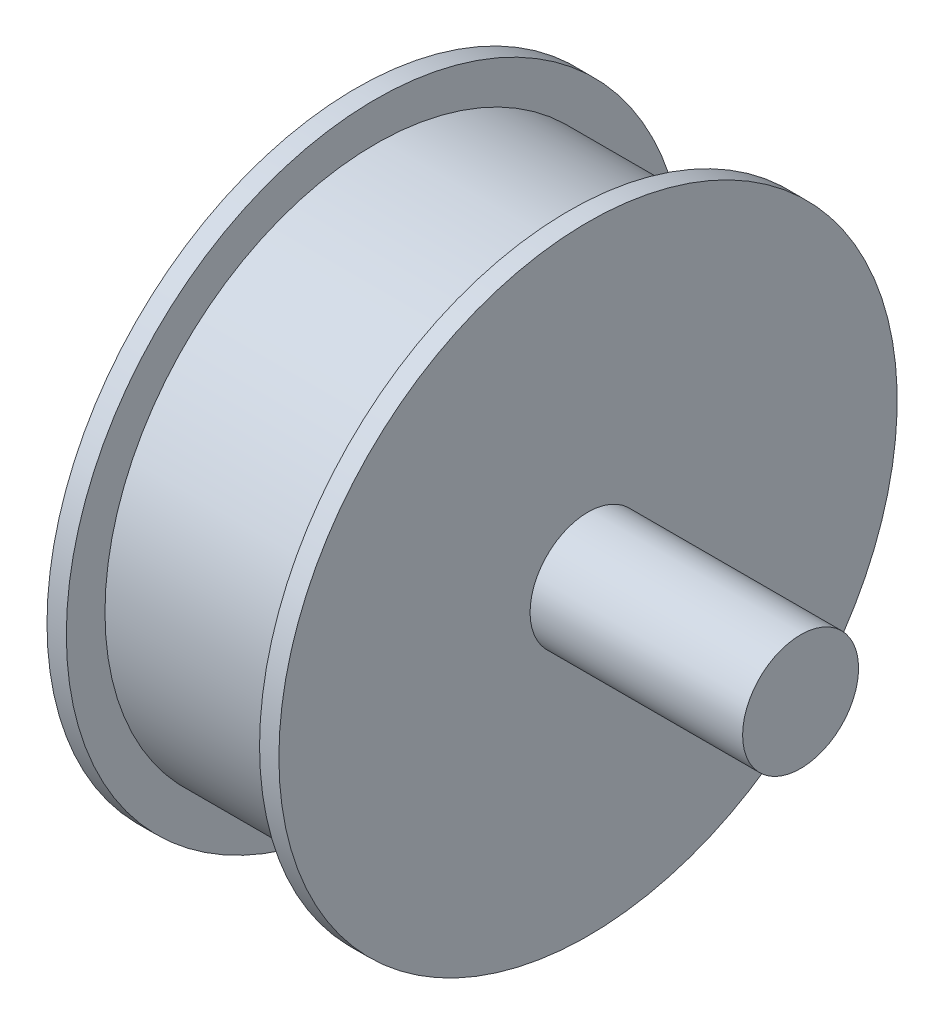
ISO-10303-21;
HEADER;
FILE_DESCRIPTION(('STEP AP214'),'2;1');
FILE_NAME('part.step','',(''),(''),'','','');
FILE_SCHEMA(('AUTOMOTIVE_DESIGN { 1 0 10303 214 1 1 1 1 }'));
ENDSEC;
DATA;
#1=APPLICATION_CONTEXT('core data for automotive mechanical design processes');
#2=APPLICATION_PROTOCOL_DEFINITION('international standard','automotive_design',2000,#1);
#3=PRODUCT_CONTEXT('',#1,'mechanical');
#4=PRODUCT('Part','Part','',(#3));
#5=PRODUCT_RELATED_PRODUCT_CATEGORY('part','',(#4));
#6=PRODUCT_DEFINITION_FORMATION('','',#4);
#7=PRODUCT_DEFINITION_CONTEXT('part definition',#1,'design');
#8=PRODUCT_DEFINITION('design','',#6,#7);
#9=PRODUCT_DEFINITION_SHAPE('','',#8);
#10=(LENGTH_UNIT() NAMED_UNIT(*) SI_UNIT(.MILLI.,.METRE.));
#11=(NAMED_UNIT(*) PLANE_ANGLE_UNIT() SI_UNIT($,.RADIAN.));
#12=(NAMED_UNIT(*) SI_UNIT($,.STERADIAN.) SOLID_ANGLE_UNIT());
#13=UNCERTAINTY_MEASURE_WITH_UNIT(LENGTH_MEASURE(1.E-05),#10,'distance_accuracy_value','');
#14=(GEOMETRIC_REPRESENTATION_CONTEXT(3) GLOBAL_UNCERTAINTY_ASSIGNED_CONTEXT((#13)) GLOBAL_UNIT_ASSIGNED_CONTEXT((#10,
#11,#12)) REPRESENTATION_CONTEXT('',''));
#15=CARTESIAN_POINT('',(0.,0.,0.));
#16=DIRECTION('',(0.,0.,1.));
#17=DIRECTION('',(1.,0.,0.));
#18=AXIS2_PLACEMENT_3D('',#15,#16,#17);
#19=CARTESIAN_POINT('',(-27.5,0.,0.));
#20=DIRECTION('',(1.,0.,0.));
#21=DIRECTION('',(0.,0.,-1.));
#22=AXIS2_PLACEMENT_3D('',#19,#20,#21);
#23=PLANE('',#22);
#24=CARTESIAN_POINT('',(-27.5,0.,0.));
#25=DIRECTION('',(-1.,0.,0.));
#26=DIRECTION('',(0.,0.,1.));
#27=AXIS2_PLACEMENT_3D('',#24,#25,#26);
#28=CIRCLE('',#27,5.);
#29=CARTESIAN_POINT('',(-27.5,0.,5.));
#30=VERTEX_POINT('',#29);
#31=EDGE_CURVE('E46',#30,#30,#28,.T.);
#32=ORIENTED_EDGE('',*,*,#31,.T.);
#33=EDGE_LOOP('',(#32));
#34=FACE_BOUND('',#33,.T.);
#35=ADVANCED_FACE('F35',(#34),#23,.F.);
#36=CARTESIAN_POINT('',(-27.5,0.,0.));
#37=DIRECTION('',(-1.,0.,0.));
#38=DIRECTION('',(0.,0.,1.));
#39=AXIS2_PLACEMENT_3D('',#36,#37,#38);
#40=CYLINDRICAL_SURFACE('',#39,5.);
#41=ORIENTED_EDGE('',*,*,#31,.F.);
#42=EDGE_LOOP('',(#41));
#43=FACE_BOUND('',#42,.T.);
#44=CARTESIAN_POINT('',(-30.,0.,0.));
#45=DIRECTION('',(-1.,0.,0.));
#46=DIRECTION('',(0.,0.,1.));
#47=AXIS2_PLACEMENT_3D('',#44,#45,#46);
#48=CIRCLE('',#47,5.);
#49=CARTESIAN_POINT('',(-30.,0.,5.));
#50=VERTEX_POINT('',#49);
#51=EDGE_CURVE('E50',#50,#50,#48,.T.);
#52=ORIENTED_EDGE('',*,*,#51,.T.);
#53=EDGE_LOOP('',(#52));
#54=FACE_BOUND('',#53,.T.);
#55=ADVANCED_FACE('F103',(#43,#54),#40,.F.);
#56=CARTESIAN_POINT('',(-30.,10.,0.));
#57=DIRECTION('',(1.,0.,0.));
#58=DIRECTION('',(0.,0.,-1.));
#59=AXIS2_PLACEMENT_3D('',#56,#57,#58);
#60=PLANE('',#59);
#61=CARTESIAN_POINT('',(-30.,0.,0.));
#62=DIRECTION('',(1.,0.,0.));
#63=DIRECTION('',(0.,0.,-1.));
#64=AXIS2_PLACEMENT_3D('',#61,#62,#63);
#65=CIRCLE('',#64,9.);
#66=CARTESIAN_POINT('',(-30.,0.,-9.));
#67=VERTEX_POINT('',#66);
#68=EDGE_CURVE('E42',#67,#67,#65,.F.);
#69=ORIENTED_EDGE('',*,*,#68,.T.);
#70=EDGE_LOOP('',(#69));
#71=FACE_BOUND('',#70,.T.);
#72=ORIENTED_EDGE('',*,*,#51,.F.);
#73=EDGE_LOOP('',(#72));
#74=FACE_BOUND('',#73,.T.);
#75=ADVANCED_FACE('F108',(#71,#74),#60,.F.);
#76=CARTESIAN_POINT('',(-27.5,0.,0.));
#77=DIRECTION('',(-1.,0.,0.));
#78=DIRECTION('',(0.,0.,1.));
#79=AXIS2_PLACEMENT_3D('',#76,#77,#78);
#80=CYLINDRICAL_SURFACE('',#79,10.);
#81=CARTESIAN_POINT('',(-29.,0.,0.));
#82=DIRECTION('',(1.,0.,0.));
#83=DIRECTION('',(0.,0.,-1.));
#84=AXIS2_PLACEMENT_3D('',#81,#82,#83);
#85=CIRCLE('',#84,10.);
#86=CARTESIAN_POINT('',(-29.,0.,-10.));
#87=VERTEX_POINT('',#86);
#88=EDGE_CURVE('E10',#87,#87,#85,.T.);
#89=ORIENTED_EDGE('',*,*,#88,.T.);
#90=EDGE_LOOP('',(#89));
#91=FACE_BOUND('',#90,.T.);
#92=CARTESIAN_POINT('',(-25.,0.,0.));
#93=DIRECTION('',(-1.,0.,0.));
#94=DIRECTION('',(0.,0.,1.));
#95=AXIS2_PLACEMENT_3D('',#92,#93,#94);
#96=CIRCLE('',#95,10.);
#97=CARTESIAN_POINT('',(-25.,0.,10.));
#98=VERTEX_POINT('',#97);
#99=EDGE_CURVE('E55',#98,#98,#96,.T.);
#100=ORIENTED_EDGE('',*,*,#99,.T.);
#101=EDGE_LOOP('',(#100));
#102=FACE_BOUND('',#101,.T.);
#103=ADVANCED_FACE('F114',(#91,#102),#80,.T.);
#104=CARTESIAN_POINT('',(-25.,10.,0.));
#105=DIRECTION('',(1.,0.,0.));
#106=DIRECTION('',(0.,0.,-1.));
#107=AXIS2_PLACEMENT_3D('',#104,#105,#106);
#108=PLANE('',#107);
#109=ORIENTED_EDGE('',*,*,#99,.F.);
#110=EDGE_LOOP('',(#109));
#111=FACE_BOUND('',#110,.T.);
#112=CARTESIAN_POINT('',(-25.,0.,0.));
#113=DIRECTION('',(-1.,0.,0.));
#114=DIRECTION('',(0.,0.,1.));
#115=AXIS2_PLACEMENT_3D('',#112,#113,#114);
#116=CIRCLE('',#115,30.);
#117=CARTESIAN_POINT('',(-25.,0.,30.));
#118=VERTEX_POINT('',#117);
#119=EDGE_CURVE('E58',#118,#118,#116,.T.);
#120=ORIENTED_EDGE('',*,*,#119,.T.);
#121=EDGE_LOOP('',(#120));
#122=FACE_BOUND('',#121,.T.);
#123=ADVANCED_FACE('F117',(#111,#122),#108,.F.);
#124=CARTESIAN_POINT('',(-27.5,0.,0.));
#125=DIRECTION('',(-1.,0.,0.));
#126=DIRECTION('',(0.,0.,1.));
#127=AXIS2_PLACEMENT_3D('',#124,#125,#126);
#128=CYLINDRICAL_SURFACE('',#127,30.);
#129=ORIENTED_EDGE('',*,*,#119,.F.);
#130=EDGE_LOOP('',(#129));
#131=FACE_BOUND('',#130,.T.);
#132=CARTESIAN_POINT('',(-30.,0.,0.));
#133=DIRECTION('',(-1.,0.,0.));
#134=DIRECTION('',(0.,0.,1.));
#135=AXIS2_PLACEMENT_3D('',#132,#133,#134);
#136=CIRCLE('',#135,30.);
#137=CARTESIAN_POINT('',(-30.,0.,30.));
#138=VERTEX_POINT('',#137);
#139=EDGE_CURVE('E61',#138,#138,#136,.T.);
#140=ORIENTED_EDGE('',*,*,#139,.T.);
#141=EDGE_LOOP('',(#140));
#142=FACE_BOUND('',#141,.T.);
#143=ADVANCED_FACE('F120',(#131,#142),#128,.F.);
#144=CARTESIAN_POINT('',(-30.,40.,0.));
#145=DIRECTION('',(1.,0.,0.));
#146=DIRECTION('',(0.,0.,-1.));
#147=AXIS2_PLACEMENT_3D('',#144,#145,#146);
#148=PLANE('',#147);
#149=ORIENTED_EDGE('',*,*,#139,.F.);
#150=EDGE_LOOP('',(#149));
#151=FACE_BOUND('',#150,.T.);
#152=CARTESIAN_POINT('',(-30.,0.,0.));
#153=DIRECTION('',(-1.,0.,0.));
#154=DIRECTION('',(0.,0.,1.));
#155=AXIS2_PLACEMENT_3D('',#152,#153,#154);
#156=CIRCLE('',#155,40.);
#157=CARTESIAN_POINT('',(-30.,0.,40.));
#158=VERTEX_POINT('',#157);
#159=EDGE_CURVE('E64',#158,#158,#156,.T.);
#160=ORIENTED_EDGE('',*,*,#159,.T.);
#161=EDGE_LOOP('',(#160));
#162=FACE_BOUND('',#161,.T.);
#163=ADVANCED_FACE('F124',(#151,#162),#148,.F.);
#164=CARTESIAN_POINT('',(-27.5,0.,0.));
#165=DIRECTION('',(-1.,0.,0.));
#166=DIRECTION('',(0.,0.,1.));
#167=AXIS2_PLACEMENT_3D('',#164,#165,#166);
#168=CYLINDRICAL_SURFACE('',#167,40.);
#169=ORIENTED_EDGE('',*,*,#159,.F.);
#170=EDGE_LOOP('',(#169));
#171=FACE_BOUND('',#170,.T.);
#172=CARTESIAN_POINT('',(-27.5,0.,0.));
#173=DIRECTION('',(-1.,0.,0.));
#174=DIRECTION('',(0.,0.,1.));
#175=AXIS2_PLACEMENT_3D('',#172,#173,#174);
#176=CIRCLE('',#175,40.);
#177=CARTESIAN_POINT('',(-27.5,0.,40.));
#178=VERTEX_POINT('',#177);
#179=EDGE_CURVE('E67',#178,#178,#176,.T.);
#180=ORIENTED_EDGE('',*,*,#179,.T.);
#181=EDGE_LOOP('',(#180));
#182=FACE_BOUND('',#181,.T.);
#183=ADVANCED_FACE('F128',(#171,#182),#168,.T.);
#184=CARTESIAN_POINT('',(-27.5,35.,0.));
#185=DIRECTION('',(-1.,0.,0.));
#186=DIRECTION('',(0.,0.,1.));
#187=AXIS2_PLACEMENT_3D('',#184,#185,#186);
#188=PLANE('',#187);
#189=ORIENTED_EDGE('',*,*,#179,.F.);
#190=EDGE_LOOP('',(#189));
#191=FACE_BOUND('',#190,.T.);
#192=CARTESIAN_POINT('',(-27.5,0.,0.));
#193=DIRECTION('',(-1.,0.,0.));
#194=DIRECTION('',(0.,0.,1.));
#195=AXIS2_PLACEMENT_3D('',#192,#193,#194);
#196=CIRCLE('',#195,35.);
#197=CARTESIAN_POINT('',(-27.5,0.,35.));
#198=VERTEX_POINT('',#197);
#199=EDGE_CURVE('E70',#198,#198,#196,.T.);
#200=ORIENTED_EDGE('',*,*,#199,.T.);
#201=EDGE_LOOP('',(#200));
#202=FACE_BOUND('',#201,.T.);
#203=ADVANCED_FACE('F132',(#191,#202),#188,.F.);
#204=CARTESIAN_POINT('',(-27.5,0.,0.));
#205=DIRECTION('',(-1.,0.,0.));
#206=DIRECTION('',(0.,0.,1.));
#207=AXIS2_PLACEMENT_3D('',#204,#205,#206);
#208=CYLINDRICAL_SURFACE('',#207,35.);
#209=ORIENTED_EDGE('',*,*,#199,.F.);
#210=EDGE_LOOP('',(#209));
#211=FACE_BOUND('',#210,.T.);
#212=CARTESIAN_POINT('',(-2.49999999999999,0.,0.));
#213=DIRECTION('',(-1.,0.,0.));
#214=DIRECTION('',(0.,0.,1.));
#215=AXIS2_PLACEMENT_3D('',#212,#213,#214);
#216=CIRCLE('',#215,35.);
#217=CARTESIAN_POINT('',(-2.49999999999999,0.,35.));
#218=VERTEX_POINT('',#217);
#219=EDGE_CURVE('E73',#218,#218,#216,.T.);
#220=ORIENTED_EDGE('',*,*,#219,.T.);
#221=EDGE_LOOP('',(#220));
#222=FACE_BOUND('',#221,.T.);
#223=ADVANCED_FACE('F136',(#211,#222),#208,.T.);
#224=CARTESIAN_POINT('',(-2.49999999999999,40.,0.));
#225=DIRECTION('',(1.,0.,0.));
#226=DIRECTION('',(0.,0.,-1.));
#227=AXIS2_PLACEMENT_3D('',#224,#225,#226);
#228=PLANE('',#227);
#229=ORIENTED_EDGE('',*,*,#219,.F.);
#230=EDGE_LOOP('',(#229));
#231=FACE_BOUND('',#230,.T.);
#232=CARTESIAN_POINT('',(-2.5,0.,0.));
#233=DIRECTION('',(-1.,0.,0.));
#234=DIRECTION('',(0.,0.,1.));
#235=AXIS2_PLACEMENT_3D('',#232,#233,#234);
#236=CIRCLE('',#235,40.);
#237=CARTESIAN_POINT('',(-2.5,0.,40.));
#238=VERTEX_POINT('',#237);
#239=EDGE_CURVE('E76',#238,#238,#236,.T.);
#240=ORIENTED_EDGE('',*,*,#239,.T.);
#241=EDGE_LOOP('',(#240));
#242=FACE_BOUND('',#241,.T.);
#243=ADVANCED_FACE('F140',(#231,#242),#228,.F.);
#244=CARTESIAN_POINT('',(-27.5,0.,0.));
#245=DIRECTION('',(-1.,0.,0.));
#246=DIRECTION('',(0.,0.,1.));
#247=AXIS2_PLACEMENT_3D('',#244,#245,#246);
#248=CYLINDRICAL_SURFACE('',#247,40.);
#249=ORIENTED_EDGE('',*,*,#239,.F.);
#250=EDGE_LOOP('',(#249));
#251=FACE_BOUND('',#250,.T.);
#252=CARTESIAN_POINT('',(0.,0.,0.));
#253=DIRECTION('',(-1.,0.,0.));
#254=DIRECTION('',(0.,0.,1.));
#255=AXIS2_PLACEMENT_3D('',#252,#253,#254);
#256=CIRCLE('',#255,40.);
#257=CARTESIAN_POINT('',(0.,0.,40.));
#258=VERTEX_POINT('',#257);
#259=EDGE_CURVE('E79',#258,#258,#256,.T.);
#260=ORIENTED_EDGE('',*,*,#259,.T.);
#261=EDGE_LOOP('',(#260));
#262=FACE_BOUND('',#261,.T.);
#263=ADVANCED_FACE('F144',(#251,#262),#248,.T.);
#264=CARTESIAN_POINT('',(0.,7.5,0.));
#265=DIRECTION('',(-1.,0.,0.));
#266=DIRECTION('',(0.,0.,1.));
#267=AXIS2_PLACEMENT_3D('',#264,#265,#266);
#268=PLANE('',#267);
#269=ORIENTED_EDGE('',*,*,#259,.F.);
#270=EDGE_LOOP('',(#269));
#271=FACE_BOUND('',#270,.T.);
#272=CARTESIAN_POINT('',(0.,0.,0.));
#273=DIRECTION('',(-1.,0.,0.));
#274=DIRECTION('',(0.,0.,1.));
#275=AXIS2_PLACEMENT_3D('',#272,#273,#274);
#276=CIRCLE('',#275,7.5);
#277=CARTESIAN_POINT('',(0.,0.,7.5));
#278=VERTEX_POINT('',#277);
#279=EDGE_CURVE('E82',#278,#278,#276,.T.);
#280=ORIENTED_EDGE('',*,*,#279,.T.);
#281=EDGE_LOOP('',(#280));
#282=FACE_BOUND('',#281,.T.);
#283=ADVANCED_FACE('F99',(#271,#282),#268,.F.);
#284=CARTESIAN_POINT('',(-27.5,0.,0.));
#285=DIRECTION('',(-1.,0.,0.));
#286=DIRECTION('',(0.,0.,1.));
#287=AXIS2_PLACEMENT_3D('',#284,#285,#286);
#288=CYLINDRICAL_SURFACE('',#287,7.5);
#289=ORIENTED_EDGE('',*,*,#279,.F.);
#290=EDGE_LOOP('',(#289));
#291=FACE_BOUND('',#290,.T.);
#292=CARTESIAN_POINT('',(27.5,0.,0.));
#293=DIRECTION('',(-1.,0.,0.));
#294=DIRECTION('',(0.,0.,1.));
#295=AXIS2_PLACEMENT_3D('',#292,#293,#294);
#296=CIRCLE('',#295,7.5);
#297=CARTESIAN_POINT('',(27.5,0.,7.5));
#298=VERTEX_POINT('',#297);
#299=EDGE_CURVE('E85',#298,#298,#296,.T.);
#300=ORIENTED_EDGE('',*,*,#299,.T.);
#301=EDGE_LOOP('',(#300));
#302=FACE_BOUND('',#301,.T.);
#303=ADVANCED_FACE('F89',(#291,#302),#288,.T.);
#304=CARTESIAN_POINT('',(27.5,0.,0.));
#305=DIRECTION('',(-1.,0.,0.));
#306=DIRECTION('',(0.,0.,1.));
#307=AXIS2_PLACEMENT_3D('',#304,#305,#306);
#308=PLANE('',#307);
#309=ORIENTED_EDGE('',*,*,#299,.F.);
#310=EDGE_LOOP('',(#309));
#311=FACE_BOUND('',#310,.T.);
#312=ADVANCED_FACE('F91',(#311),#308,.F.);
#313=CARTESIAN_POINT('',(-29.,0.,0.));
#314=DIRECTION('',(1.,0.,0.));
#315=DIRECTION('',(0.,0.,-1.));
#316=AXIS2_PLACEMENT_3D('',#313,#314,#315);
#317=TOROIDAL_SURFACE('',#316,9.,1.);
#318=ORIENTED_EDGE('',*,*,#88,.F.);
#319=EDGE_LOOP('',(#318));
#320=FACE_BOUND('',#319,.T.);
#321=ORIENTED_EDGE('',*,*,#68,.F.);
#322=EDGE_LOOP('',(#321));
#323=FACE_BOUND('',#322,.T.);
#324=ADVANCED_FACE('F37',(#320,#323),#317,.T.);
#325=CLOSED_SHELL('',(#35,#55,#75,#103,#123,#143,#163,#183,#203,#223,#243,#263,#283,#303,#312,#324));
#326=MANIFOLD_SOLID_BREP('B2',#325);
#327=ADVANCED_BREP_SHAPE_REPRESENTATION('',(#18,#326),#14);
#328=SHAPE_DEFINITION_REPRESENTATION(#9,#327);
ENDSEC;
END-ISO-10303-21;
